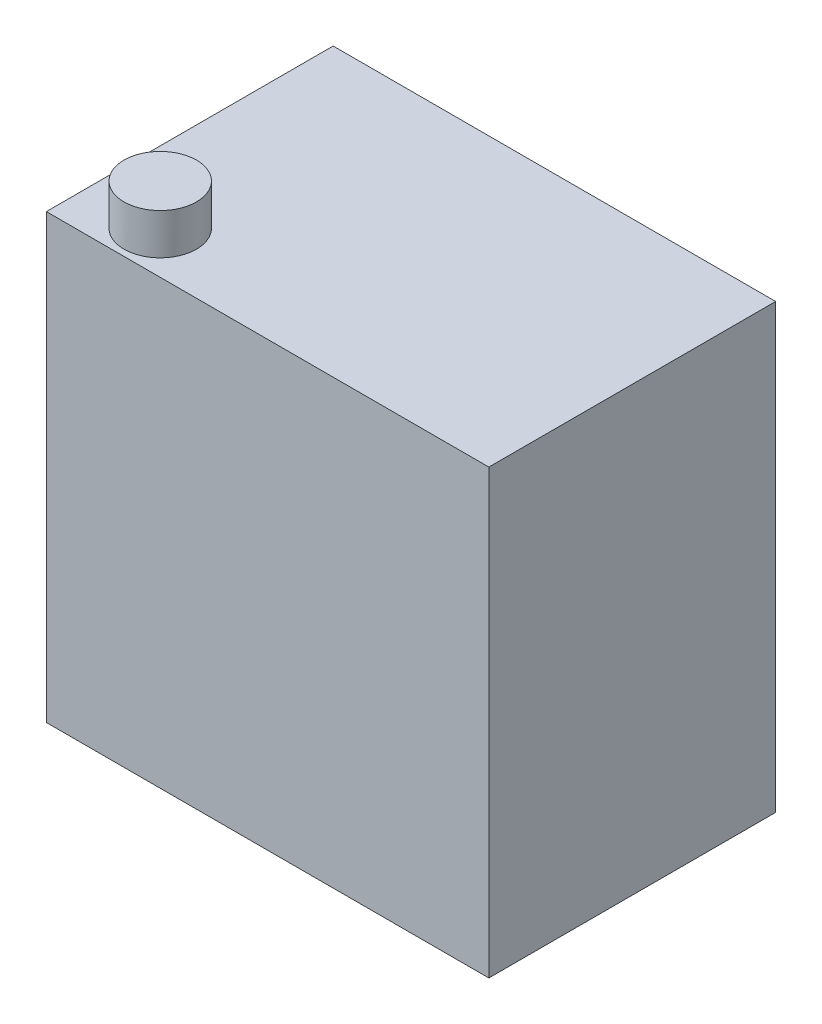
ISO-10303-21;
HEADER;
FILE_DESCRIPTION(('STEP AP214'),'2;1');
FILE_NAME('part.step','',(''),(''),'','','');
FILE_SCHEMA(('AUTOMOTIVE_DESIGN { 1 0 10303 214 1 1 1 1 }'));
ENDSEC;
DATA;
#1=APPLICATION_CONTEXT('core data for automotive mechanical design processes');
#2=APPLICATION_PROTOCOL_DEFINITION('international standard','automotive_design',2000,#1);
#3=PRODUCT_CONTEXT('',#1,'mechanical');
#4=PRODUCT('Part','Part','',(#3));
#5=PRODUCT_RELATED_PRODUCT_CATEGORY('part','',(#4));
#6=PRODUCT_DEFINITION_FORMATION('','',#4);
#7=PRODUCT_DEFINITION_CONTEXT('part definition',#1,'design');
#8=PRODUCT_DEFINITION('design','',#6,#7);
#9=PRODUCT_DEFINITION_SHAPE('','',#8);
#10=(LENGTH_UNIT() NAMED_UNIT(*) SI_UNIT(.MILLI.,.METRE.));
#11=(NAMED_UNIT(*) PLANE_ANGLE_UNIT() SI_UNIT($,.RADIAN.));
#12=(NAMED_UNIT(*) SI_UNIT($,.STERADIAN.) SOLID_ANGLE_UNIT());
#13=UNCERTAINTY_MEASURE_WITH_UNIT(LENGTH_MEASURE(1.E-05),#10,'distance_accuracy_value','');
#14=(GEOMETRIC_REPRESENTATION_CONTEXT(3) GLOBAL_UNCERTAINTY_ASSIGNED_CONTEXT((#13)) GLOBAL_UNIT_ASSIGNED_CONTEXT((#10,
#11,#12)) REPRESENTATION_CONTEXT('',''));
#15=CARTESIAN_POINT('',(0.,0.,0.));
#16=DIRECTION('',(0.,0.,1.));
#17=DIRECTION('',(1.,0.,0.));
#18=AXIS2_PLACEMENT_3D('',#15,#16,#17);
#19=CARTESIAN_POINT('',(0.,108.,70.));
#20=DIRECTION('',(0.,-1.,0.));
#21=DIRECTION('',(0.,0.,-1.));
#22=AXIS2_PLACEMENT_3D('',#19,#20,#21);
#23=PLANE('',#22);
#24=DIRECTION('',(-1.,0.,0.));
#25=VECTOR('',#24,1.);
#26=CARTESIAN_POINT('',(0.,108.,0.));
#27=LINE('',#26,#25);
#28=CARTESIAN_POINT('',(108.,108.,0.));
#29=VERTEX_POINT('',#28);
#30=CARTESIAN_POINT('',(0.,108.,0.));
#31=VERTEX_POINT('',#30);
#32=EDGE_CURVE('E98',#29,#31,#27,.T.);
#33=ORIENTED_EDGE('',*,*,#32,.T.);
#34=DIRECTION('',(0.,0.,-1.));
#35=VECTOR('',#34,1.);
#36=CARTESIAN_POINT('',(0.,108.,70.));
#37=LINE('',#36,#35);
#38=CARTESIAN_POINT('',(0.,108.,70.));
#39=VERTEX_POINT('',#38);
#40=EDGE_CURVE('E91',#39,#31,#37,.T.);
#41=ORIENTED_EDGE('',*,*,#40,.F.);
#42=DIRECTION('',(-1.,0.,0.));
#43=VECTOR('',#42,1.);
#44=CARTESIAN_POINT('',(0.,108.,70.));
#45=LINE('',#44,#43);
#46=CARTESIAN_POINT('',(108.,108.,70.));
#47=VERTEX_POINT('',#46);
#48=EDGE_CURVE('E47',#47,#39,#45,.T.);
#49=ORIENTED_EDGE('',*,*,#48,.F.);
#50=DIRECTION('',(0.,0.,-1.));
#51=VECTOR('',#50,1.);
#52=CARTESIAN_POINT('',(108.,108.,70.));
#53=LINE('',#52,#51);
#54=EDGE_CURVE('E106',#47,#29,#53,.T.);
#55=ORIENTED_EDGE('',*,*,#54,.T.);
#56=EDGE_LOOP('',(#33,#41,#49,#55));
#57=FACE_BOUND('',#56,.T.);
#58=CARTESIAN_POINT('',(17.4293429342934,108.,59.635463546355));
#59=DIRECTION('',(0.,-1.,0.));
#60=DIRECTION('',(0.,0.,-1.));
#61=AXIS2_PLACEMENT_3D('',#58,#59,#60);
#62=CIRCLE('',#61,8.84449621179166);
#63=CARTESIAN_POINT('',(17.4293429342934,108.,50.7909673345634));
#64=VERTEX_POINT('',#63);
#65=EDGE_CURVE('E11',#64,#64,#62,.F.);
#66=ORIENTED_EDGE('',*,*,#65,.F.);
#67=EDGE_LOOP('',(#66));
#68=FACE_BOUND('',#67,.T.);
#69=ADVANCED_FACE('F32',(#57,#68),#23,.F.);
#70=CARTESIAN_POINT('',(0.,0.,70.));
#71=DIRECTION('',(1.,0.,0.));
#72=DIRECTION('',(0.,0.,-1.));
#73=AXIS2_PLACEMENT_3D('',#70,#71,#72);
#74=PLANE('',#73);
#75=DIRECTION('',(0.,-1.,0.));
#76=VECTOR('',#75,1.);
#77=CARTESIAN_POINT('',(0.,0.,0.));
#78=LINE('',#77,#76);
#79=CARTESIAN_POINT('',(0.,0.,0.));
#80=VERTEX_POINT('',#79);
#81=EDGE_CURVE('E78',#31,#80,#78,.T.);
#82=ORIENTED_EDGE('',*,*,#81,.T.);
#83=DIRECTION('',(0.,0.,-1.));
#84=VECTOR('',#83,1.);
#85=CARTESIAN_POINT('',(0.,0.,70.));
#86=LINE('',#85,#84);
#87=CARTESIAN_POINT('',(0.,0.,70.));
#88=VERTEX_POINT('',#87);
#89=EDGE_CURVE('E40',#88,#80,#86,.T.);
#90=ORIENTED_EDGE('',*,*,#89,.F.);
#91=DIRECTION('',(0.,-1.,0.));
#92=VECTOR('',#91,1.);
#93=CARTESIAN_POINT('',(0.,0.,70.));
#94=LINE('',#93,#92);
#95=EDGE_CURVE('E100',#39,#88,#94,.T.);
#96=ORIENTED_EDGE('',*,*,#95,.F.);
#97=ORIENTED_EDGE('',*,*,#40,.T.);
#98=EDGE_LOOP('',(#82,#90,#96,#97));
#99=FACE_BOUND('',#98,.T.);
#100=ADVANCED_FACE('F34',(#99),#74,.F.);
#101=CARTESIAN_POINT('',(0.,0.,70.));
#102=DIRECTION('',(0.,1.,0.));
#103=DIRECTION('',(0.,0.,1.));
#104=AXIS2_PLACEMENT_3D('',#101,#102,#103);
#105=PLANE('',#104);
#106=DIRECTION('',(1.,0.,0.));
#107=VECTOR('',#106,1.);
#108=CARTESIAN_POINT('',(0.,0.,0.));
#109=LINE('',#108,#107);
#110=CARTESIAN_POINT('',(108.,0.,0.));
#111=VERTEX_POINT('',#110);
#112=EDGE_CURVE('E73',#80,#111,#109,.T.);
#113=ORIENTED_EDGE('',*,*,#112,.T.);
#114=DIRECTION('',(0.,0.,-1.));
#115=VECTOR('',#114,1.);
#116=CARTESIAN_POINT('',(108.,0.,70.));
#117=LINE('',#116,#115);
#118=CARTESIAN_POINT('',(108.,0.,70.));
#119=VERTEX_POINT('',#118);
#120=EDGE_CURVE('E89',#119,#111,#117,.T.);
#121=ORIENTED_EDGE('',*,*,#120,.F.);
#122=DIRECTION('',(1.,0.,0.));
#123=VECTOR('',#122,1.);
#124=CARTESIAN_POINT('',(0.,0.,70.));
#125=LINE('',#124,#123);
#126=EDGE_CURVE('E86',#88,#119,#125,.T.);
#127=ORIENTED_EDGE('',*,*,#126,.F.);
#128=ORIENTED_EDGE('',*,*,#89,.T.);
#129=EDGE_LOOP('',(#113,#121,#127,#128));
#130=FACE_BOUND('',#129,.T.);
#131=ADVANCED_FACE('F85',(#130),#105,.F.);
#132=CARTESIAN_POINT('',(108.,0.,70.));
#133=DIRECTION('',(-1.,0.,0.));
#134=DIRECTION('',(0.,0.,1.));
#135=AXIS2_PLACEMENT_3D('',#132,#133,#134);
#136=PLANE('',#135);
#137=DIRECTION('',(0.,1.,0.));
#138=VECTOR('',#137,1.);
#139=CARTESIAN_POINT('',(108.,0.,0.));
#140=LINE('',#139,#138);
#141=EDGE_CURVE('E79',#111,#29,#140,.T.);
#142=ORIENTED_EDGE('',*,*,#141,.T.);
#143=ORIENTED_EDGE('',*,*,#54,.F.);
#144=DIRECTION('',(0.,1.,0.));
#145=VECTOR('',#144,1.);
#146=CARTESIAN_POINT('',(108.,0.,70.));
#147=LINE('',#146,#145);
#148=EDGE_CURVE('E52',#119,#47,#147,.T.);
#149=ORIENTED_EDGE('',*,*,#148,.F.);
#150=ORIENTED_EDGE('',*,*,#120,.T.);
#151=EDGE_LOOP('',(#142,#143,#149,#150));
#152=FACE_BOUND('',#151,.T.);
#153=ADVANCED_FACE('F110',(#152),#136,.F.);
#154=CARTESIAN_POINT('',(0.,108.,70.));
#155=DIRECTION('',(0.,0.,-1.));
#156=DIRECTION('',(-1.,0.,0.));
#157=AXIS2_PLACEMENT_3D('',#154,#155,#156);
#158=PLANE('',#157);
#159=ORIENTED_EDGE('',*,*,#95,.T.);
#160=ORIENTED_EDGE('',*,*,#126,.T.);
#161=ORIENTED_EDGE('',*,*,#148,.T.);
#162=ORIENTED_EDGE('',*,*,#48,.T.);
#163=EDGE_LOOP('',(#159,#160,#161,#162));
#164=FACE_BOUND('',#163,.T.);
#165=ADVANCED_FACE('F113',(#164),#158,.F.);
#166=CARTESIAN_POINT('',(0.,108.,0.));
#167=DIRECTION('',(0.,0.,-1.));
#168=DIRECTION('',(-1.,0.,0.));
#169=AXIS2_PLACEMENT_3D('',#166,#167,#168);
#170=PLANE('',#169);
#171=ORIENTED_EDGE('',*,*,#81,.F.);
#172=ORIENTED_EDGE('',*,*,#32,.F.);
#173=ORIENTED_EDGE('',*,*,#141,.F.);
#174=ORIENTED_EDGE('',*,*,#112,.F.);
#175=EDGE_LOOP('',(#171,#172,#173,#174));
#176=FACE_BOUND('',#175,.T.);
#177=ADVANCED_FACE('F75',(#176),#170,.T.);
#178=CARTESIAN_POINT('',(17.4293429342934,118.,59.635463546355));
#179=DIRECTION('',(0.,-1.,0.));
#180=DIRECTION('',(0.,0.,-1.));
#181=AXIS2_PLACEMENT_3D('',#178,#179,#180);
#182=CYLINDRICAL_SURFACE('',#181,8.84449621179166);
#183=CARTESIAN_POINT('',(17.4293429342934,118.,59.635463546355));
#184=DIRECTION('',(0.,1.,0.));
#185=DIRECTION('',(0.,0.,1.));
#186=AXIS2_PLACEMENT_3D('',#183,#184,#185);
#187=CIRCLE('',#186,8.84449621179166);
#188=CARTESIAN_POINT('',(17.4293429342934,118.,68.4799597581467));
#189=VERTEX_POINT('',#188);
#190=EDGE_CURVE('E92',#189,#189,#187,.T.);
#191=ORIENTED_EDGE('',*,*,#190,.F.);
#192=EDGE_LOOP('',(#191));
#193=FACE_BOUND('',#192,.T.);
#194=ORIENTED_EDGE('',*,*,#65,.T.);
#195=EDGE_LOOP('',(#194));
#196=FACE_BOUND('',#195,.T.);
#197=ADVANCED_FACE('F120',(#193,#196),#182,.T.);
#198=CARTESIAN_POINT('',(17.4293429342934,118.,59.635463546355));
#199=DIRECTION('',(0.,1.,0.));
#200=DIRECTION('',(0.,0.,1.));
#201=AXIS2_PLACEMENT_3D('',#198,#199,#200);
#202=PLANE('',#201);
#203=ORIENTED_EDGE('',*,*,#190,.T.);
#204=EDGE_LOOP('',(#203));
#205=FACE_BOUND('',#204,.T.);
#206=ADVANCED_FACE('F160',(#205),#202,.T.);
#207=CLOSED_SHELL('',(#69,#100,#131,#153,#165,#177,#197,#206));
#208=MANIFOLD_SOLID_BREP('B2',#207);
#209=ADVANCED_BREP_SHAPE_REPRESENTATION('',(#18,#208),#14);
#210=SHAPE_DEFINITION_REPRESENTATION(#9,#209);
ENDSEC;
END-ISO-10303-21;
